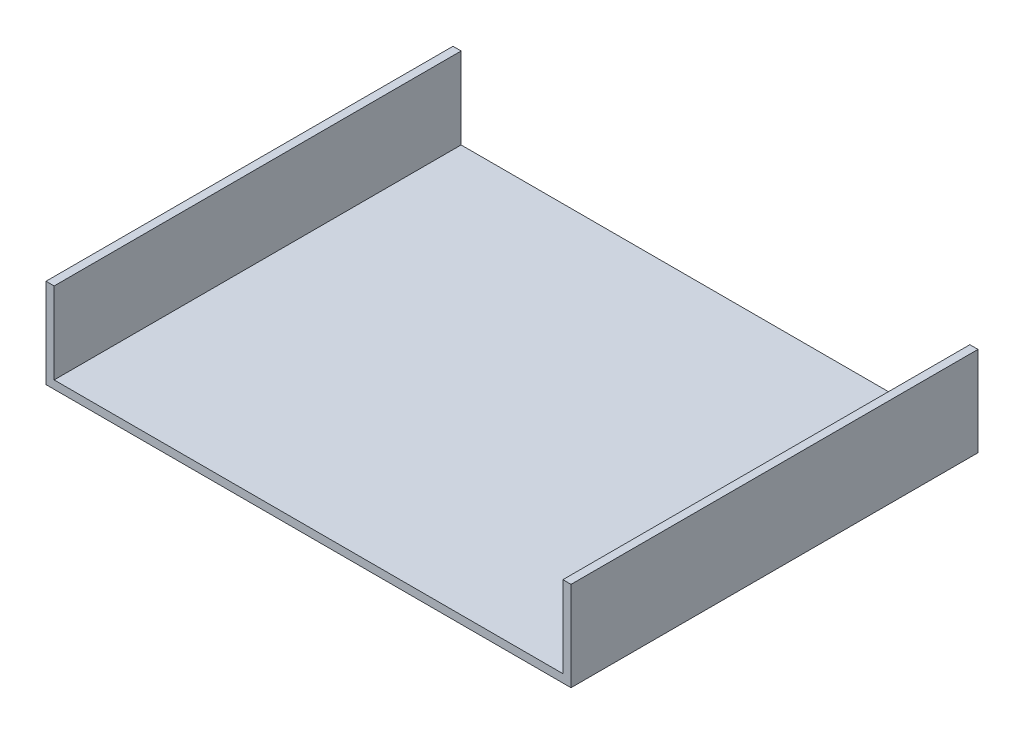
ISO-10303-21;
HEADER;
FILE_DESCRIPTION(('STEP AP214'),'2;1');
FILE_NAME('part.step','',(''),(''),'','','');
FILE_SCHEMA(('AUTOMOTIVE_DESIGN { 1 0 10303 214 1 1 1 1 }'));
ENDSEC;
DATA;
#1=APPLICATION_CONTEXT('core data for automotive mechanical design processes');
#2=APPLICATION_PROTOCOL_DEFINITION('international standard','automotive_design',2000,#1);
#3=PRODUCT_CONTEXT('',#1,'mechanical');
#4=PRODUCT('Part','Part','',(#3));
#5=PRODUCT_RELATED_PRODUCT_CATEGORY('part','',(#4));
#6=PRODUCT_DEFINITION_FORMATION('','',#4);
#7=PRODUCT_DEFINITION_CONTEXT('part definition',#1,'design');
#8=PRODUCT_DEFINITION('design','',#6,#7);
#9=PRODUCT_DEFINITION_SHAPE('','',#8);
#10=(LENGTH_UNIT() NAMED_UNIT(*) SI_UNIT(.MILLI.,.METRE.));
#11=(NAMED_UNIT(*) PLANE_ANGLE_UNIT() SI_UNIT($,.RADIAN.));
#12=(NAMED_UNIT(*) SI_UNIT($,.STERADIAN.) SOLID_ANGLE_UNIT());
#13=UNCERTAINTY_MEASURE_WITH_UNIT(LENGTH_MEASURE(1.E-05),#10,'distance_accuracy_value','');
#14=(GEOMETRIC_REPRESENTATION_CONTEXT(3) GLOBAL_UNCERTAINTY_ASSIGNED_CONTEXT((#13)) GLOBAL_UNIT_ASSIGNED_CONTEXT((#10,
#11,#12)) REPRESENTATION_CONTEXT('',''));
#15=CARTESIAN_POINT('',(0.,0.,0.));
#16=DIRECTION('',(0.,0.,1.));
#17=DIRECTION('',(1.,0.,0.));
#18=AXIS2_PLACEMENT_3D('',#15,#16,#17);
#19=CARTESIAN_POINT('',(-200.,0.,10000.));
#20=DIRECTION('',(0.,-1.,0.));
#21=DIRECTION('',(0.,0.,-1.));
#22=AXIS2_PLACEMENT_3D('',#19,#20,#21);
#23=PLANE('',#22);
#24=DIRECTION('',(-1.,0.,0.));
#25=VECTOR('',#24,1.);
#26=CARTESIAN_POINT('',(-200.,0.,0.));
#27=LINE('',#26,#25);
#28=CARTESIAN_POINT('',(0.,0.,0.));
#29=VERTEX_POINT('',#28);
#30=CARTESIAN_POINT('',(-200.,0.,0.));
#31=VERTEX_POINT('',#30);
#32=EDGE_CURVE('E146',#29,#31,#27,.T.);
#33=ORIENTED_EDGE('',*,*,#32,.T.);
#34=DIRECTION('',(0.,0.,-1.));
#35=VECTOR('',#34,1.);
#36=CARTESIAN_POINT('',(-200.,0.,10000.));
#37=LINE('',#36,#35);
#38=CARTESIAN_POINT('',(-200.,0.,10000.));
#39=VERTEX_POINT('',#38);
#40=EDGE_CURVE('E11',#39,#31,#37,.T.);
#41=ORIENTED_EDGE('',*,*,#40,.F.);
#42=DIRECTION('',(-1.,0.,0.));
#43=VECTOR('',#42,1.);
#44=CARTESIAN_POINT('',(-200.,0.,10000.));
#45=LINE('',#44,#43);
#46=CARTESIAN_POINT('',(0.,0.,10000.));
#47=VERTEX_POINT('',#46);
#48=EDGE_CURVE('E168',#47,#39,#45,.T.);
#49=ORIENTED_EDGE('',*,*,#48,.F.);
#50=DIRECTION('',(0.,0.,-1.));
#51=VECTOR('',#50,1.);
#52=CARTESIAN_POINT('',(0.,0.,10000.));
#53=LINE('',#52,#51);
#54=EDGE_CURVE('E142',#47,#29,#53,.T.);
#55=ORIENTED_EDGE('',*,*,#54,.T.);
#56=EDGE_LOOP('',(#33,#41,#49,#55));
#57=FACE_BOUND('',#56,.T.);
#58=ADVANCED_FACE('F45',(#57),#23,.F.);
#59=CARTESIAN_POINT('',(-200.,0.,10000.));
#60=DIRECTION('',(1.,0.,0.));
#61=DIRECTION('',(0.,1.,0.));
#62=AXIS2_PLACEMENT_3D('',#59,#60,#61);
#63=PLANE('',#62);
#64=DIRECTION('',(0.,-1.,0.));
#65=VECTOR('',#64,1.);
#66=CARTESIAN_POINT('',(-200.,0.,0.));
#67=LINE('',#66,#65);
#68=CARTESIAN_POINT('',(-200.000000000003,-2200.,0.));
#69=VERTEX_POINT('',#68);
#70=EDGE_CURVE('E150',#31,#69,#67,.T.);
#71=ORIENTED_EDGE('',*,*,#70,.T.);
#72=DIRECTION('',(0.,0.,-1.));
#73=VECTOR('',#72,1.);
#74=CARTESIAN_POINT('',(-200.000000000003,-2200.,10000.));
#75=LINE('',#74,#73);
#76=CARTESIAN_POINT('',(-200.000000000003,-2200.,10000.));
#77=VERTEX_POINT('',#76);
#78=EDGE_CURVE('E54',#77,#69,#75,.T.);
#79=ORIENTED_EDGE('',*,*,#78,.F.);
#80=DIRECTION('',(0.,-1.,0.));
#81=VECTOR('',#80,1.);
#82=CARTESIAN_POINT('',(-200.,0.,10000.));
#83=LINE('',#82,#81);
#84=EDGE_CURVE('E105',#39,#77,#83,.T.);
#85=ORIENTED_EDGE('',*,*,#84,.F.);
#86=ORIENTED_EDGE('',*,*,#40,.T.);
#87=EDGE_LOOP('',(#71,#79,#85,#86));
#88=FACE_BOUND('',#87,.T.);
#89=ADVANCED_FACE('F214',(#88),#63,.F.);
#90=CARTESIAN_POINT('',(-200.000000000003,-2200.,10000.));
#91=DIRECTION('',(0.,1.,0.));
#92=DIRECTION('',(0.,0.,1.));
#93=AXIS2_PLACEMENT_3D('',#90,#91,#92);
#94=PLANE('',#93);
#95=DIRECTION('',(1.,0.,0.));
#96=VECTOR('',#95,1.);
#97=CARTESIAN_POINT('',(-200.000000000003,-2200.,0.));
#98=LINE('',#97,#96);
#99=CARTESIAN_POINT('',(12700.,-2200.,0.));
#100=VERTEX_POINT('',#99);
#101=EDGE_CURVE('E153',#69,#100,#98,.T.);
#102=ORIENTED_EDGE('',*,*,#101,.T.);
#103=DIRECTION('',(0.,0.,-1.));
#104=VECTOR('',#103,1.);
#105=CARTESIAN_POINT('',(12700.,-2200.,10000.));
#106=LINE('',#105,#104);
#107=CARTESIAN_POINT('',(12700.,-2200.,10000.));
#108=VERTEX_POINT('',#107);
#109=EDGE_CURVE('E179',#108,#100,#106,.T.);
#110=ORIENTED_EDGE('',*,*,#109,.F.);
#111=DIRECTION('',(1.,0.,0.));
#112=VECTOR('',#111,1.);
#113=CARTESIAN_POINT('',(-200.000000000003,-2200.,10000.));
#114=LINE('',#113,#112);
#115=EDGE_CURVE('E189',#77,#108,#114,.T.);
#116=ORIENTED_EDGE('',*,*,#115,.F.);
#117=ORIENTED_EDGE('',*,*,#78,.T.);
#118=EDGE_LOOP('',(#102,#110,#116,#117));
#119=FACE_BOUND('',#118,.T.);
#120=ADVANCED_FACE('F187',(#119),#94,.F.);
#121=CARTESIAN_POINT('',(12700.,-2200.,10000.));
#122=DIRECTION('',(-1.,0.,0.));
#123=DIRECTION('',(0.,0.,1.));
#124=AXIS2_PLACEMENT_3D('',#121,#122,#123);
#125=PLANE('',#124);
#126=DIRECTION('',(0.,1.,0.));
#127=VECTOR('',#126,1.);
#128=CARTESIAN_POINT('',(12700.,-2200.,0.));
#129=LINE('',#128,#127);
#130=CARTESIAN_POINT('',(12700.,0.,0.));
#131=VERTEX_POINT('',#130);
#132=EDGE_CURVE('E156',#100,#131,#129,.T.);
#133=ORIENTED_EDGE('',*,*,#132,.T.);
#134=DIRECTION('',(0.,0.,-1.));
#135=VECTOR('',#134,1.);
#136=CARTESIAN_POINT('',(12700.,0.,10000.));
#137=LINE('',#136,#135);
#138=CARTESIAN_POINT('',(12700.,0.,10000.));
#139=VERTEX_POINT('',#138);
#140=EDGE_CURVE('E175',#139,#131,#137,.T.);
#141=ORIENTED_EDGE('',*,*,#140,.F.);
#142=DIRECTION('',(0.,1.,0.));
#143=VECTOR('',#142,1.);
#144=CARTESIAN_POINT('',(12700.,-2200.,10000.));
#145=LINE('',#144,#143);
#146=EDGE_CURVE('E202',#108,#139,#145,.T.);
#147=ORIENTED_EDGE('',*,*,#146,.F.);
#148=ORIENTED_EDGE('',*,*,#109,.T.);
#149=EDGE_LOOP('',(#133,#141,#147,#148));
#150=FACE_BOUND('',#149,.T.);
#151=ADVANCED_FACE('F197',(#150),#125,.F.);
#152=CARTESIAN_POINT('',(12500.,0.,10000.));
#153=DIRECTION('',(0.,-1.,0.));
#154=DIRECTION('',(0.,0.,-1.));
#155=AXIS2_PLACEMENT_3D('',#152,#153,#154);
#156=PLANE('',#155);
#157=DIRECTION('',(-1.,0.,0.));
#158=VECTOR('',#157,1.);
#159=CARTESIAN_POINT('',(12500.,0.,0.));
#160=LINE('',#159,#158);
#161=CARTESIAN_POINT('',(12500.,0.,0.));
#162=VERTEX_POINT('',#161);
#163=EDGE_CURVE('E159',#131,#162,#160,.T.);
#164=ORIENTED_EDGE('',*,*,#163,.T.);
#165=DIRECTION('',(0.,0.,-1.));
#166=VECTOR('',#165,1.);
#167=CARTESIAN_POINT('',(12500.,0.,10000.));
#168=LINE('',#167,#166);
#169=CARTESIAN_POINT('',(12500.,0.,10000.));
#170=VERTEX_POINT('',#169);
#171=EDGE_CURVE('E135',#170,#162,#168,.T.);
#172=ORIENTED_EDGE('',*,*,#171,.F.);
#173=DIRECTION('',(-1.,0.,0.));
#174=VECTOR('',#173,1.);
#175=CARTESIAN_POINT('',(12500.,0.,10000.));
#176=LINE('',#175,#174);
#177=EDGE_CURVE('E124',#139,#170,#176,.T.);
#178=ORIENTED_EDGE('',*,*,#177,.F.);
#179=ORIENTED_EDGE('',*,*,#140,.T.);
#180=EDGE_LOOP('',(#164,#172,#178,#179));
#181=FACE_BOUND('',#180,.T.);
#182=ADVANCED_FACE('F200',(#181),#156,.F.);
#183=CARTESIAN_POINT('',(12500.,-2000.,10000.));
#184=DIRECTION('',(1.,0.,0.));
#185=DIRECTION('',(0.,0.,-1.));
#186=AXIS2_PLACEMENT_3D('',#183,#184,#185);
#187=PLANE('',#186);
#188=DIRECTION('',(0.,-1.,0.));
#189=VECTOR('',#188,1.);
#190=CARTESIAN_POINT('',(12500.,-2000.,0.));
#191=LINE('',#190,#189);
#192=CARTESIAN_POINT('',(12500.,-2000.,0.));
#193=VERTEX_POINT('',#192);
#194=EDGE_CURVE('E133',#162,#193,#191,.T.);
#195=ORIENTED_EDGE('',*,*,#194,.T.);
#196=DIRECTION('',(0.,0.,-1.));
#197=VECTOR('',#196,1.);
#198=CARTESIAN_POINT('',(12500.,-2000.,10000.));
#199=LINE('',#198,#197);
#200=CARTESIAN_POINT('',(12500.,-2000.,10000.));
#201=VERTEX_POINT('',#200);
#202=EDGE_CURVE('E130',#201,#193,#199,.T.);
#203=ORIENTED_EDGE('',*,*,#202,.F.);
#204=DIRECTION('',(0.,-1.,0.));
#205=VECTOR('',#204,1.);
#206=CARTESIAN_POINT('',(12500.,-2000.,10000.));
#207=LINE('',#206,#205);
#208=EDGE_CURVE('E118',#170,#201,#207,.T.);
#209=ORIENTED_EDGE('',*,*,#208,.F.);
#210=ORIENTED_EDGE('',*,*,#171,.T.);
#211=EDGE_LOOP('',(#195,#203,#209,#210));
#212=FACE_BOUND('',#211,.T.);
#213=ADVANCED_FACE('F131',(#212),#187,.F.);
#214=CARTESIAN_POINT('',(2.44929359829471E-13,-2000.,10000.));
#215=DIRECTION('',(0.,-1.,0.));
#216=DIRECTION('',(0.,0.,-1.));
#217=AXIS2_PLACEMENT_3D('',#214,#215,#216);
#218=PLANE('',#217);
#219=DIRECTION('',(-1.,0.,0.));
#220=VECTOR('',#219,1.);
#221=CARTESIAN_POINT('',(2.44929359829471E-13,-2000.,0.));
#222=LINE('',#221,#220);
#223=CARTESIAN_POINT('',(2.44929359829471E-13,-2000.,0.));
#224=VERTEX_POINT('',#223);
#225=EDGE_CURVE('E91',#193,#224,#222,.T.);
#226=ORIENTED_EDGE('',*,*,#225,.T.);
#227=DIRECTION('',(0.,0.,-1.));
#228=VECTOR('',#227,1.);
#229=CARTESIAN_POINT('',(2.44929359829471E-13,-2000.,10000.));
#230=LINE('',#229,#228);
#231=CARTESIAN_POINT('',(2.44929359829471E-13,-2000.,10000.));
#232=VERTEX_POINT('',#231);
#233=EDGE_CURVE('E136',#232,#224,#230,.T.);
#234=ORIENTED_EDGE('',*,*,#233,.F.);
#235=DIRECTION('',(-1.,0.,0.));
#236=VECTOR('',#235,1.);
#237=CARTESIAN_POINT('',(2.44929359829471E-13,-2000.,10000.));
#238=LINE('',#237,#236);
#239=EDGE_CURVE('E122',#201,#232,#238,.T.);
#240=ORIENTED_EDGE('',*,*,#239,.F.);
#241=ORIENTED_EDGE('',*,*,#202,.T.);
#242=EDGE_LOOP('',(#226,#234,#240,#241));
#243=FACE_BOUND('',#242,.T.);
#244=ADVANCED_FACE('F138',(#243),#218,.F.);
#245=CARTESIAN_POINT('',(0.,0.,10000.));
#246=DIRECTION('',(-1.,0.,0.));
#247=DIRECTION('',(0.,-1.,0.));
#248=AXIS2_PLACEMENT_3D('',#245,#246,#247);
#249=PLANE('',#248);
#250=DIRECTION('',(0.,1.,0.));
#251=VECTOR('',#250,1.);
#252=CARTESIAN_POINT('',(0.,0.,0.));
#253=LINE('',#252,#251);
#254=EDGE_CURVE('E97',#224,#29,#253,.T.);
#255=ORIENTED_EDGE('',*,*,#254,.T.);
#256=ORIENTED_EDGE('',*,*,#54,.F.);
#257=DIRECTION('',(0.,1.,0.));
#258=VECTOR('',#257,1.);
#259=CARTESIAN_POINT('',(0.,0.,10000.));
#260=LINE('',#259,#258);
#261=EDGE_CURVE('E62',#232,#47,#260,.T.);
#262=ORIENTED_EDGE('',*,*,#261,.F.);
#263=ORIENTED_EDGE('',*,*,#233,.T.);
#264=EDGE_LOOP('',(#255,#256,#262,#263));
#265=FACE_BOUND('',#264,.T.);
#266=ADVANCED_FACE('F230',(#265),#249,.F.);
#267=CARTESIAN_POINT('',(0.,0.,10000.));
#268=DIRECTION('',(0.,0.,-1.));
#269=DIRECTION('',(-1.,0.,0.));
#270=AXIS2_PLACEMENT_3D('',#267,#268,#269);
#271=PLANE('',#270);
#272=ORIENTED_EDGE('',*,*,#48,.T.);
#273=ORIENTED_EDGE('',*,*,#84,.T.);
#274=ORIENTED_EDGE('',*,*,#115,.T.);
#275=ORIENTED_EDGE('',*,*,#146,.T.);
#276=ORIENTED_EDGE('',*,*,#177,.T.);
#277=ORIENTED_EDGE('',*,*,#208,.T.);
#278=ORIENTED_EDGE('',*,*,#239,.T.);
#279=ORIENTED_EDGE('',*,*,#261,.T.);
#280=EDGE_LOOP('',(#272,#273,#274,#275,#276,#277,#278,#279));
#281=FACE_BOUND('',#280,.T.);
#282=ADVANCED_FACE('F120',(#281),#271,.F.);
#283=CARTESIAN_POINT('',(0.,0.,0.));
#284=DIRECTION('',(0.,0.,-1.));
#285=DIRECTION('',(-1.,0.,0.));
#286=AXIS2_PLACEMENT_3D('',#283,#284,#285);
#287=PLANE('',#286);
#288=ORIENTED_EDGE('',*,*,#32,.F.);
#289=ORIENTED_EDGE('',*,*,#254,.F.);
#290=ORIENTED_EDGE('',*,*,#225,.F.);
#291=ORIENTED_EDGE('',*,*,#194,.F.);
#292=ORIENTED_EDGE('',*,*,#163,.F.);
#293=ORIENTED_EDGE('',*,*,#132,.F.);
#294=ORIENTED_EDGE('',*,*,#101,.F.);
#295=ORIENTED_EDGE('',*,*,#70,.F.);
#296=EDGE_LOOP('',(#288,#289,#290,#291,#292,#293,#294,#295));
#297=FACE_BOUND('',#296,.T.);
#298=ADVANCED_FACE('F193',(#297),#287,.T.);
#299=CLOSED_SHELL('',(#58,#89,#120,#151,#182,#213,#244,#266,#282,#298));
#300=MANIFOLD_SOLID_BREP('B2',#299);
#301=ADVANCED_BREP_SHAPE_REPRESENTATION('',(#18,#300),#14);
#302=SHAPE_DEFINITION_REPRESENTATION(#9,#301);
ENDSEC;
END-ISO-10303-21;
